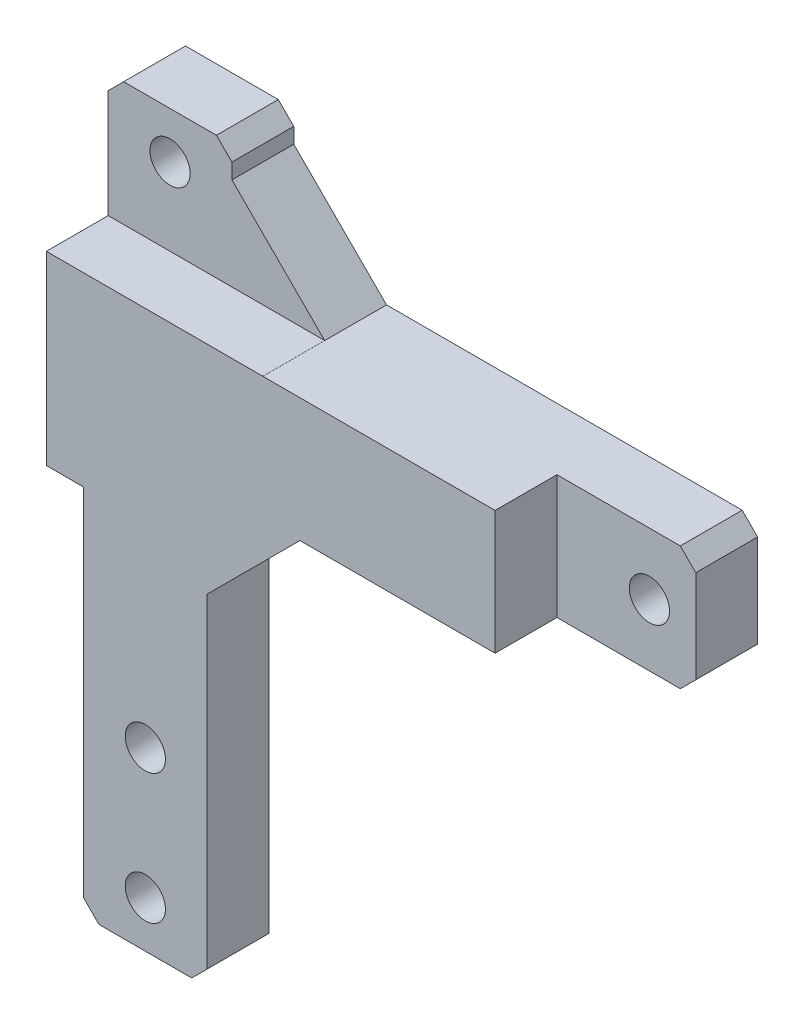
ISO-10303-21;
HEADER;
FILE_DESCRIPTION(('STEP AP214'),'2;1');
FILE_NAME('part.step','',(''),(''),'','','');
FILE_SCHEMA(('AUTOMOTIVE_DESIGN { 1 0 10303 214 1 1 1 1 }'));
ENDSEC;
DATA;
#1=APPLICATION_CONTEXT('core data for automotive mechanical design processes');
#2=APPLICATION_PROTOCOL_DEFINITION('international standard','automotive_design',2000,#1);
#3=PRODUCT_CONTEXT('',#1,'mechanical');
#4=PRODUCT('Part','Part','',(#3));
#5=PRODUCT_RELATED_PRODUCT_CATEGORY('part','',(#4));
#6=PRODUCT_DEFINITION_FORMATION('','',#4);
#7=PRODUCT_DEFINITION_CONTEXT('part definition',#1,'design');
#8=PRODUCT_DEFINITION('design','',#6,#7);
#9=PRODUCT_DEFINITION_SHAPE('','',#8);
#10=(LENGTH_UNIT() NAMED_UNIT(*) SI_UNIT(.MILLI.,.METRE.));
#11=(NAMED_UNIT(*) PLANE_ANGLE_UNIT() SI_UNIT($,.RADIAN.));
#12=(NAMED_UNIT(*) SI_UNIT($,.STERADIAN.) SOLID_ANGLE_UNIT());
#13=UNCERTAINTY_MEASURE_WITH_UNIT(LENGTH_MEASURE(1.E-05),#10,'distance_accuracy_value','');
#14=(GEOMETRIC_REPRESENTATION_CONTEXT(3) GLOBAL_UNCERTAINTY_ASSIGNED_CONTEXT((#13)) GLOBAL_UNIT_ASSIGNED_CONTEXT((#10,
#11,#12)) REPRESENTATION_CONTEXT('',''));
#15=CARTESIAN_POINT('',(0.,0.,0.));
#16=DIRECTION('',(0.,0.,1.));
#17=DIRECTION('',(1.,0.,0.));
#18=AXIS2_PLACEMENT_3D('',#15,#16,#17);
#19=CARTESIAN_POINT('',(0.,0.,4.));
#20=DIRECTION('',(0.,0.,1.));
#21=DIRECTION('',(1.,0.,0.));
#22=AXIS2_PLACEMENT_3D('',#19,#20,#21);
#23=PLANE('',#22);
#24=CARTESIAN_POINT('',(-6.29999999999999,-15.,4.));
#25=DIRECTION('',(0.,0.,1.));
#26=DIRECTION('',(1.,0.,0.));
#27=AXIS2_PLACEMENT_3D('',#24,#25,#26);
#28=CIRCLE('',#27,0.65);
#29=CARTESIAN_POINT('',(-5.65,-15.,4.));
#30=VERTEX_POINT('',#29);
#31=EDGE_CURVE('E274',#30,#30,#28,.T.);
#32=ORIENTED_EDGE('',*,*,#31,.F.);
#33=EDGE_LOOP('',(#32));
#34=FACE_BOUND('',#33,.T.);
#35=CARTESIAN_POINT('',(-6.29999999999999,-10.8,4.));
#36=DIRECTION('',(0.,0.,1.));
#37=DIRECTION('',(1.,0.,0.));
#38=AXIS2_PLACEMENT_3D('',#35,#36,#37);
#39=CIRCLE('',#38,0.65);
#40=CARTESIAN_POINT('',(-5.65,-10.8,4.));
#41=VERTEX_POINT('',#40);
#42=EDGE_CURVE('E271',#41,#41,#39,.T.);
#43=ORIENTED_EDGE('',*,*,#42,.F.);
#44=EDGE_LOOP('',(#43));
#45=FACE_BOUND('',#44,.T.);
#46=DIRECTION('',(1.,0.,0.));
#47=VECTOR('',#46,1.);
#48=CARTESIAN_POINT('',(-8.3,-16.5,4.));
#49=LINE('',#48,#47);
#50=CARTESIAN_POINT('',(-7.79999999999999,-16.5,4.));
#51=VERTEX_POINT('',#50);
#52=CARTESIAN_POINT('',(-4.8,-16.5,4.));
#53=VERTEX_POINT('',#52);
#54=EDGE_CURVE('E295',#51,#53,#49,.T.);
#55=ORIENTED_EDGE('',*,*,#54,.T.);
#56=DIRECTION('',(-0.707106781186551,-0.707106781186544,0.));
#57=VECTOR('',#56,1.);
#58=CARTESIAN_POINT('',(5.85000000000002,-5.85000000000008,4.));
#59=LINE('',#58,#57);
#60=CARTESIAN_POINT('',(-4.29999999999999,-16.,4.));
#61=VERTEX_POINT('',#60);
#62=EDGE_CURVE('E374',#53,#61,#59,.F.);
#63=ORIENTED_EDGE('',*,*,#62,.T.);
#64=DIRECTION('',(0.,1.,0.));
#65=VECTOR('',#64,1.);
#66=CARTESIAN_POINT('',(-4.29999999999999,-16.5,4.));
#67=LINE('',#66,#65);
#68=CARTESIAN_POINT('',(-4.29999999999999,-5.49999999999999,4.));
#69=VERTEX_POINT('',#68);
#70=EDGE_CURVE('E298',#61,#69,#67,.T.);
#71=ORIENTED_EDGE('',*,*,#70,.T.);
#72=DIRECTION('',(-0.707106781186551,-0.707106781186544,0.));
#73=VECTOR('',#72,1.);
#74=CARTESIAN_POINT('',(-1.29999999999997,-2.5,4.));
#75=LINE('',#74,#73);
#76=CARTESIAN_POINT('',(-1.29999999999997,-2.5,4.));
#77=VERTEX_POINT('',#76);
#78=EDGE_CURVE('E346',#69,#77,#75,.F.);
#79=ORIENTED_EDGE('',*,*,#78,.T.);
#80=DIRECTION('',(1.,0.,0.));
#81=VECTOR('',#80,1.);
#82=CARTESIAN_POINT('',(-4.29999999999999,-2.5,4.));
#83=LINE('',#82,#81);
#84=CARTESIAN_POINT('',(5.01005685993889,-2.5,4.));
#85=VERTEX_POINT('',#84);
#86=EDGE_CURVE('E300',#77,#85,#83,.T.);
#87=ORIENTED_EDGE('',*,*,#86,.T.);
#88=DIRECTION('',(0.,1.,0.));
#89=VECTOR('',#88,1.);
#90=CARTESIAN_POINT('',(5.01005685993889,1.5,4.));
#91=LINE('',#90,#89);
#92=CARTESIAN_POINT('',(5.01005685993889,1.5,4.));
#93=VERTEX_POINT('',#92);
#94=EDGE_CURVE('E218',#85,#93,#91,.T.);
#95=ORIENTED_EDGE('',*,*,#94,.T.);
#96=DIRECTION('',(-1.,0.,0.));
#97=VECTOR('',#96,1.);
#98=CARTESIAN_POINT('',(-5.5,1.5,4.));
#99=LINE('',#98,#97);
#100=CARTESIAN_POINT('',(-2.50000000000001,1.5,4.));
#101=VERTEX_POINT('',#100);
#102=EDGE_CURVE('E284',#93,#101,#99,.T.);
#103=ORIENTED_EDGE('',*,*,#102,.T.);
#104=DIRECTION('',(0.707106781186544,-0.707106781186551,0.));
#105=VECTOR('',#104,1.);
#106=CARTESIAN_POINT('',(-5.5,4.50000000000002,4.));
#107=LINE('',#106,#105);
#108=CARTESIAN_POINT('',(-2.50112500265622,1.50112500265622,4.));
#109=VERTEX_POINT('',#108);
#110=EDGE_CURVE('E351',#101,#109,#107,.F.);
#111=ORIENTED_EDGE('',*,*,#110,.T.);
#112=DIRECTION('',(-1.,0.,0.));
#113=VECTOR('',#112,1.);
#114=CARTESIAN_POINT('',(-5.5,1.50112500265622,4.));
#115=LINE('',#114,#113);
#116=CARTESIAN_POINT('',(-9.5,1.50112500265622,4.));
#117=VERTEX_POINT('',#116);
#118=EDGE_CURVE('E235',#109,#117,#115,.T.);
#119=ORIENTED_EDGE('',*,*,#118,.T.);
#120=DIRECTION('',(0.,-1.,0.));
#121=VECTOR('',#120,1.);
#122=CARTESIAN_POINT('',(-9.5,1.5,4.));
#123=LINE('',#122,#121);
#124=CARTESIAN_POINT('',(-9.5,-4.5,4.));
#125=VERTEX_POINT('',#124);
#126=EDGE_CURVE('E287',#117,#125,#123,.T.);
#127=ORIENTED_EDGE('',*,*,#126,.T.);
#128=DIRECTION('',(1.,0.,0.));
#129=VECTOR('',#128,1.);
#130=CARTESIAN_POINT('',(-9.5,-4.5,4.));
#131=LINE('',#130,#129);
#132=CARTESIAN_POINT('',(-8.3,-4.5,4.));
#133=VERTEX_POINT('',#132);
#134=EDGE_CURVE('E290',#125,#133,#131,.T.);
#135=ORIENTED_EDGE('',*,*,#134,.T.);
#136=DIRECTION('',(0.,-1.,0.));
#137=VECTOR('',#136,1.);
#138=CARTESIAN_POINT('',(-8.3,-4.5,4.));
#139=LINE('',#138,#137);
#140=CARTESIAN_POINT('',(-8.3,-16.,4.));
#141=VERTEX_POINT('',#140);
#142=EDGE_CURVE('E292',#133,#141,#139,.T.);
#143=ORIENTED_EDGE('',*,*,#142,.T.);
#144=DIRECTION('',(-0.707106781186545,0.70710678118655,0.));
#145=VECTOR('',#144,1.);
#146=CARTESIAN_POINT('',(-12.15,-12.1499999999999,4.));
#147=LINE('',#146,#145);
#148=EDGE_CURVE('E372',#141,#51,#147,.F.);
#149=ORIENTED_EDGE('',*,*,#148,.T.);
#150=EDGE_LOOP('',(#55,#63,#71,#79,#87,#95,#103,#111,#119,#127,#135,#143,#149));
#151=FACE_BOUND('',#150,.T.);
#152=ADVANCED_FACE('F42',(#34,#45,#151),#23,.T.);
#153=CARTESIAN_POINT('',(0.,0.,0.));
#154=DIRECTION('',(0.,0.,1.));
#155=DIRECTION('',(1.,0.,0.));
#156=AXIS2_PLACEMENT_3D('',#153,#154,#155);
#157=PLANE('',#156);
#158=CARTESIAN_POINT('',(-7.5,4.,0.));
#159=DIRECTION('',(0.,0.,1.));
#160=DIRECTION('',(1.,0.,0.));
#161=AXIS2_PLACEMENT_3D('',#158,#159,#160);
#162=CIRCLE('',#161,0.65);
#163=CARTESIAN_POINT('',(-6.85,4.,0.));
#164=VERTEX_POINT('',#163);
#165=EDGE_CURVE('E277',#164,#164,#162,.T.);
#166=ORIENTED_EDGE('',*,*,#165,.T.);
#167=EDGE_LOOP('',(#166));
#168=FACE_BOUND('',#167,.T.);
#169=CARTESIAN_POINT('',(8.,-0.5,0.));
#170=DIRECTION('',(0.,0.,1.));
#171=DIRECTION('',(1.,0.,0.));
#172=AXIS2_PLACEMENT_3D('',#169,#170,#171);
#173=CIRCLE('',#172,0.649999999999999);
#174=CARTESIAN_POINT('',(8.65,-0.5,0.));
#175=VERTEX_POINT('',#174);
#176=EDGE_CURVE('E280',#175,#175,#173,.T.);
#177=ORIENTED_EDGE('',*,*,#176,.T.);
#178=EDGE_LOOP('',(#177));
#179=FACE_BOUND('',#178,.T.);
#180=DIRECTION('',(0.,-1.,0.));
#181=VECTOR('',#180,1.);
#182=CARTESIAN_POINT('',(-9.5,1.5,0.));
#183=LINE('',#182,#181);
#184=CARTESIAN_POINT('',(-9.5,4.99999999999999,0.));
#185=VERTEX_POINT('',#184);
#186=CARTESIAN_POINT('',(-9.5,-4.5,0.));
#187=VERTEX_POINT('',#186);
#188=EDGE_CURVE('E313',#185,#187,#183,.T.);
#189=ORIENTED_EDGE('',*,*,#188,.F.);
#190=DIRECTION('',(-0.707106781186551,-0.707106781186544,0.));
#191=VECTOR('',#190,1.);
#192=CARTESIAN_POINT('',(-9.5,5.,0.));
#193=LINE('',#192,#191);
#194=CARTESIAN_POINT('',(-8.99999999999999,5.5,0.));
#195=VERTEX_POINT('',#194);
#196=EDGE_CURVE('E387',#185,#195,#193,.F.);
#197=ORIENTED_EDGE('',*,*,#196,.T.);
#198=DIRECTION('',(-1.,0.,0.));
#199=VECTOR('',#198,1.);
#200=CARTESIAN_POINT('',(-9.5,5.5,0.));
#201=LINE('',#200,#199);
#202=CARTESIAN_POINT('',(-6.,5.5,0.));
#203=VERTEX_POINT('',#202);
#204=EDGE_CURVE('E310',#203,#195,#201,.T.);
#205=ORIENTED_EDGE('',*,*,#204,.F.);
#206=DIRECTION('',(-0.707106781186544,0.707106781186551,0.));
#207=VECTOR('',#206,1.);
#208=CARTESIAN_POINT('',(-6.,5.5,0.));
#209=LINE('',#208,#207);
#210=CARTESIAN_POINT('',(-5.5,4.99999999999999,0.));
#211=VERTEX_POINT('',#210);
#212=EDGE_CURVE('E381',#203,#211,#209,.F.);
#213=ORIENTED_EDGE('',*,*,#212,.T.);
#214=DIRECTION('',(0.,1.,0.));
#215=VECTOR('',#214,1.);
#216=CARTESIAN_POINT('',(-5.5,1.5,0.));
#217=LINE('',#216,#215);
#218=CARTESIAN_POINT('',(-5.5,4.50000000000002,0.));
#219=VERTEX_POINT('',#218);
#220=EDGE_CURVE('E307',#219,#211,#217,.T.);
#221=ORIENTED_EDGE('',*,*,#220,.F.);
#222=DIRECTION('',(-0.707106781186544,0.707106781186551,0.));
#223=VECTOR('',#222,1.);
#224=CARTESIAN_POINT('',(-0.500000000000016,-0.500000000000011,0.));
#225=LINE('',#224,#223);
#226=CARTESIAN_POINT('',(-2.50000000000001,1.5,0.));
#227=VERTEX_POINT('',#226);
#228=EDGE_CURVE('E348',#219,#227,#225,.F.);
#229=ORIENTED_EDGE('',*,*,#228,.T.);
#230=DIRECTION('',(-1.,0.,0.));
#231=VECTOR('',#230,1.);
#232=CARTESIAN_POINT('',(-5.5,1.5,0.));
#233=LINE('',#232,#231);
#234=CARTESIAN_POINT('',(9.,1.5,0.));
#235=VERTEX_POINT('',#234);
#236=EDGE_CURVE('E305',#235,#227,#233,.T.);
#237=ORIENTED_EDGE('',*,*,#236,.F.);
#238=DIRECTION('',(-0.707106781186544,0.707106781186551,0.));
#239=VECTOR('',#238,1.);
#240=CARTESIAN_POINT('',(9.,1.5,0.));
#241=LINE('',#240,#239);
#242=CARTESIAN_POINT('',(9.5,0.999999999999991,0.));
#243=VERTEX_POINT('',#242);
#244=EDGE_CURVE('E383',#235,#243,#241,.F.);
#245=ORIENTED_EDGE('',*,*,#244,.T.);
#246=DIRECTION('',(0.,1.,0.));
#247=VECTOR('',#246,1.);
#248=CARTESIAN_POINT('',(9.5,1.5,0.));
#249=LINE('',#248,#247);
#250=CARTESIAN_POINT('',(9.5,-2.,0.));
#251=VERTEX_POINT('',#250);
#252=EDGE_CURVE('E283',#251,#243,#249,.T.);
#253=ORIENTED_EDGE('',*,*,#252,.F.);
#254=DIRECTION('',(0.707106781186552,0.707106781186543,0.));
#255=VECTOR('',#254,1.);
#256=CARTESIAN_POINT('',(9.5,-2.,0.));
#257=LINE('',#256,#255);
#258=CARTESIAN_POINT('',(8.99999999999999,-2.5,0.));
#259=VERTEX_POINT('',#258);
#260=EDGE_CURVE('E385',#251,#259,#257,.F.);
#261=ORIENTED_EDGE('',*,*,#260,.T.);
#262=DIRECTION('',(1.,0.,0.));
#263=VECTOR('',#262,1.);
#264=CARTESIAN_POINT('',(-4.29999999999999,-2.5,0.));
#265=LINE('',#264,#263);
#266=CARTESIAN_POINT('',(-1.29999999999997,-2.5,0.));
#267=VERTEX_POINT('',#266);
#268=EDGE_CURVE('E288',#267,#259,#265,.T.);
#269=ORIENTED_EDGE('',*,*,#268,.F.);
#270=DIRECTION('',(0.707106781186551,0.707106781186544,0.));
#271=VECTOR('',#270,1.);
#272=CARTESIAN_POINT('',(0.600000000000021,-0.600000000000028,0.));
#273=LINE('',#272,#271);
#274=CARTESIAN_POINT('',(-3.6687128154348,-4.8687128154348,0.));
#275=VERTEX_POINT('',#274);
#276=EDGE_CURVE('E337',#267,#275,#273,.F.);
#277=ORIENTED_EDGE('',*,*,#276,.T.);
#278=DIRECTION('',(-1.,0.,0.));
#279=VECTOR('',#278,1.);
#280=CARTESIAN_POINT('',(-8.3,-4.8687128154348,0.));
#281=LINE('',#280,#279);
#282=CARTESIAN_POINT('',(-8.3,-4.8687128154348,0.));
#283=VERTEX_POINT('',#282);
#284=EDGE_CURVE('E256',#275,#283,#281,.T.);
#285=ORIENTED_EDGE('',*,*,#284,.T.);
#286=DIRECTION('',(0.,-1.,0.));
#287=VECTOR('',#286,1.);
#288=CARTESIAN_POINT('',(-8.3,-4.5,0.));
#289=LINE('',#288,#287);
#290=CARTESIAN_POINT('',(-8.3,-4.5,0.));
#291=VERTEX_POINT('',#290);
#292=EDGE_CURVE('E317',#291,#283,#289,.T.);
#293=ORIENTED_EDGE('',*,*,#292,.F.);
#294=DIRECTION('',(1.,0.,0.));
#295=VECTOR('',#294,1.);
#296=CARTESIAN_POINT('',(-9.5,-4.5,0.));
#297=LINE('',#296,#295);
#298=EDGE_CURVE('E315',#187,#291,#297,.T.);
#299=ORIENTED_EDGE('',*,*,#298,.F.);
#300=EDGE_LOOP('',(#189,#197,#205,#213,#221,#229,#237,#245,#253,#261,#269,#277,#285,#293,#299));
#301=FACE_BOUND('',#300,.T.);
#302=ADVANCED_FACE('F414',(#168,#179,#301),#157,.F.);
#303=CARTESIAN_POINT('',(9.5,1.5,4.));
#304=DIRECTION('',(-1.,0.,0.));
#305=DIRECTION('',(0.,0.,1.));
#306=AXIS2_PLACEMENT_3D('',#303,#304,#305);
#307=PLANE('',#306);
#308=DIRECTION('',(0.,-1.,0.));
#309=VECTOR('',#308,1.);
#310=CARTESIAN_POINT('',(9.5,1.5,2.));
#311=LINE('',#310,#309);
#312=CARTESIAN_POINT('',(9.5,0.999999999999991,2.));
#313=VERTEX_POINT('',#312);
#314=CARTESIAN_POINT('',(9.5,-2.,2.));
#315=VERTEX_POINT('',#314);
#316=EDGE_CURVE('E212',#313,#315,#311,.T.);
#317=ORIENTED_EDGE('',*,*,#316,.T.);
#318=DIRECTION('',(0.,0.,-1.));
#319=VECTOR('',#318,1.);
#320=CARTESIAN_POINT('',(9.5,-2.,4.));
#321=LINE('',#320,#319);
#322=EDGE_CURVE('E400',#315,#251,#321,.T.);
#323=ORIENTED_EDGE('',*,*,#322,.T.);
#324=ORIENTED_EDGE('',*,*,#252,.T.);
#325=DIRECTION('',(0.,0.,1.));
#326=VECTOR('',#325,1.);
#327=CARTESIAN_POINT('',(9.5,0.999999999999991,4.));
#328=LINE('',#327,#326);
#329=EDGE_CURVE('E398',#243,#313,#328,.T.);
#330=ORIENTED_EDGE('',*,*,#329,.T.);
#331=EDGE_LOOP('',(#317,#323,#324,#330));
#332=FACE_BOUND('',#331,.T.);
#333=ADVANCED_FACE('F439',(#332),#307,.F.);
#334=CARTESIAN_POINT('',(-5.5,1.5,4.));
#335=DIRECTION('',(0.,-1.,0.));
#336=DIRECTION('',(1.,0.,0.));
#337=AXIS2_PLACEMENT_3D('',#334,#335,#336);
#338=PLANE('',#337);
#339=DIRECTION('',(1.,0.,0.));
#340=VECTOR('',#339,1.);
#341=CARTESIAN_POINT('',(5.01005685993889,1.5,2.));
#342=LINE('',#341,#340);
#343=CARTESIAN_POINT('',(5.01005685993889,1.5,2.));
#344=VERTEX_POINT('',#343);
#345=CARTESIAN_POINT('',(9.,1.5,2.));
#346=VERTEX_POINT('',#345);
#347=EDGE_CURVE('E224',#344,#346,#342,.T.);
#348=ORIENTED_EDGE('',*,*,#347,.T.);
#349=DIRECTION('',(0.,0.,-1.));
#350=VECTOR('',#349,1.);
#351=CARTESIAN_POINT('',(9.,1.5,4.));
#352=LINE('',#351,#350);
#353=EDGE_CURVE('E51',#346,#235,#352,.T.);
#354=ORIENTED_EDGE('',*,*,#353,.T.);
#355=ORIENTED_EDGE('',*,*,#236,.T.);
#356=DIRECTION('',(0.,0.,1.));
#357=VECTOR('',#356,1.);
#358=CARTESIAN_POINT('',(-2.50000000000001,1.5,4.));
#359=LINE('',#358,#357);
#360=EDGE_CURVE('E335',#227,#101,#359,.T.);
#361=ORIENTED_EDGE('',*,*,#360,.T.);
#362=ORIENTED_EDGE('',*,*,#102,.F.);
#363=DIRECTION('',(0.,0.,1.));
#364=VECTOR('',#363,1.);
#365=CARTESIAN_POINT('',(5.01005685993889,1.5,2.));
#366=LINE('',#365,#364);
#367=EDGE_CURVE('E220',#344,#93,#366,.T.);
#368=ORIENTED_EDGE('',*,*,#367,.F.);
#369=EDGE_LOOP('',(#348,#354,#355,#361,#362,#368));
#370=FACE_BOUND('',#369,.T.);
#371=ADVANCED_FACE('F410',(#370),#338,.F.);
#372=CARTESIAN_POINT('',(-5.5,1.5,4.));
#373=DIRECTION('',(-1.,0.,0.));
#374=DIRECTION('',(0.,0.,1.));
#375=AXIS2_PLACEMENT_3D('',#372,#373,#374);
#376=PLANE('',#375);
#377=ORIENTED_EDGE('',*,*,#220,.T.);
#378=DIRECTION('',(0.,0.,1.));
#379=VECTOR('',#378,1.);
#380=CARTESIAN_POINT('',(-5.5,4.99999999999999,4.));
#381=LINE('',#380,#379);
#382=CARTESIAN_POINT('',(-5.5,4.99999999999999,2.));
#383=VERTEX_POINT('',#382);
#384=EDGE_CURVE('E12',#211,#383,#381,.T.);
#385=ORIENTED_EDGE('',*,*,#384,.T.);
#386=DIRECTION('',(0.,-1.,0.));
#387=VECTOR('',#386,1.);
#388=CARTESIAN_POINT('',(-5.5,5.5,2.));
#389=LINE('',#388,#387);
#390=CARTESIAN_POINT('',(-5.5,4.50000000000002,2.));
#391=VERTEX_POINT('',#390);
#392=EDGE_CURVE('E245',#383,#391,#389,.T.);
#393=ORIENTED_EDGE('',*,*,#392,.T.);
#394=DIRECTION('',(0.,0.,-1.));
#395=VECTOR('',#394,1.);
#396=CARTESIAN_POINT('',(-5.5,4.50000000000002,0.));
#397=LINE('',#396,#395);
#398=EDGE_CURVE('E332',#391,#219,#397,.T.);
#399=ORIENTED_EDGE('',*,*,#398,.T.);
#400=EDGE_LOOP('',(#377,#385,#393,#399));
#401=FACE_BOUND('',#400,.T.);
#402=ADVANCED_FACE('F489',(#401),#376,.F.);
#403=CARTESIAN_POINT('',(-9.5,5.5,4.));
#404=DIRECTION('',(0.,-1.,0.));
#405=DIRECTION('',(0.,0.,-1.));
#406=AXIS2_PLACEMENT_3D('',#403,#404,#405);
#407=PLANE('',#406);
#408=ORIENTED_EDGE('',*,*,#204,.T.);
#409=DIRECTION('',(0.,0.,1.));
#410=VECTOR('',#409,1.);
#411=CARTESIAN_POINT('',(-8.99999999999999,5.5,4.));
#412=LINE('',#411,#410);
#413=CARTESIAN_POINT('',(-8.99999999999999,5.5,2.));
#414=VERTEX_POINT('',#413);
#415=EDGE_CURVE('E392',#195,#414,#412,.T.);
#416=ORIENTED_EDGE('',*,*,#415,.T.);
#417=DIRECTION('',(1.,0.,0.));
#418=VECTOR('',#417,1.);
#419=CARTESIAN_POINT('',(-9.5,5.5,2.));
#420=LINE('',#419,#418);
#421=CARTESIAN_POINT('',(-6.,5.5,2.));
#422=VERTEX_POINT('',#421);
#423=EDGE_CURVE('E239',#414,#422,#420,.T.);
#424=ORIENTED_EDGE('',*,*,#423,.T.);
#425=DIRECTION('',(0.,0.,-1.));
#426=VECTOR('',#425,1.);
#427=CARTESIAN_POINT('',(-6.,5.5,4.));
#428=LINE('',#427,#426);
#429=EDGE_CURVE('E389',#422,#203,#428,.T.);
#430=ORIENTED_EDGE('',*,*,#429,.T.);
#431=EDGE_LOOP('',(#408,#416,#424,#430));
#432=FACE_BOUND('',#431,.T.);
#433=ADVANCED_FACE('F485',(#432),#407,.F.);
#434=CARTESIAN_POINT('',(-9.5,1.5,4.));
#435=DIRECTION('',(1.,0.,0.));
#436=DIRECTION('',(0.,1.,0.));
#437=AXIS2_PLACEMENT_3D('',#434,#435,#436);
#438=PLANE('',#437);
#439=DIRECTION('',(0.,1.,0.));
#440=VECTOR('',#439,1.);
#441=CARTESIAN_POINT('',(-9.5,1.50112500265622,2.));
#442=LINE('',#441,#440);
#443=CARTESIAN_POINT('',(-9.5,1.50112500265622,2.));
#444=VERTEX_POINT('',#443);
#445=CARTESIAN_POINT('',(-9.5,4.99999999999999,2.));
#446=VERTEX_POINT('',#445);
#447=EDGE_CURVE('E234',#444,#446,#442,.T.);
#448=ORIENTED_EDGE('',*,*,#447,.T.);
#449=DIRECTION('',(0.,0.,-1.));
#450=VECTOR('',#449,1.);
#451=CARTESIAN_POINT('',(-9.5,4.99999999999999,4.));
#452=LINE('',#451,#450);
#453=EDGE_CURVE('E378',#446,#185,#452,.T.);
#454=ORIENTED_EDGE('',*,*,#453,.T.);
#455=ORIENTED_EDGE('',*,*,#188,.T.);
#456=DIRECTION('',(0.,0.,-1.));
#457=VECTOR('',#456,1.);
#458=CARTESIAN_POINT('',(-9.5,-4.5,4.));
#459=LINE('',#458,#457);
#460=EDGE_CURVE('E323',#125,#187,#459,.T.);
#461=ORIENTED_EDGE('',*,*,#460,.F.);
#462=ORIENTED_EDGE('',*,*,#126,.F.);
#463=DIRECTION('',(0.,0.,1.));
#464=VECTOR('',#463,1.);
#465=CARTESIAN_POINT('',(-9.5,1.50112500265622,2.));
#466=LINE('',#465,#464);
#467=EDGE_CURVE('E232',#444,#117,#466,.T.);
#468=ORIENTED_EDGE('',*,*,#467,.F.);
#469=EDGE_LOOP('',(#448,#454,#455,#461,#462,#468));
#470=FACE_BOUND('',#469,.T.);
#471=ADVANCED_FACE('F481',(#470),#438,.F.);
#472=CARTESIAN_POINT('',(-9.5,-4.5,4.));
#473=DIRECTION('',(0.,1.,0.));
#474=DIRECTION('',(0.,0.,1.));
#475=AXIS2_PLACEMENT_3D('',#472,#473,#474);
#476=PLANE('',#475);
#477=ORIENTED_EDGE('',*,*,#298,.T.);
#478=DIRECTION('',(0.,0.,-1.));
#479=VECTOR('',#478,1.);
#480=CARTESIAN_POINT('',(-8.3,-4.5,4.));
#481=LINE('',#480,#479);
#482=EDGE_CURVE('E302',#133,#291,#481,.T.);
#483=ORIENTED_EDGE('',*,*,#482,.F.);
#484=ORIENTED_EDGE('',*,*,#134,.F.);
#485=ORIENTED_EDGE('',*,*,#460,.T.);
#486=EDGE_LOOP('',(#477,#483,#484,#485));
#487=FACE_BOUND('',#486,.T.);
#488=ADVANCED_FACE('F477',(#487),#476,.F.);
#489=CARTESIAN_POINT('',(-8.3,-4.5,4.));
#490=DIRECTION('',(1.,0.,0.));
#491=DIRECTION('',(0.,1.,0.));
#492=AXIS2_PLACEMENT_3D('',#489,#490,#491);
#493=PLANE('',#492);
#494=DIRECTION('',(0.,-1.,0.));
#495=VECTOR('',#494,1.);
#496=CARTESIAN_POINT('',(-8.3,-4.8687128154348,2.));
#497=LINE('',#496,#495);
#498=CARTESIAN_POINT('',(-8.3,-4.8687128154348,2.));
#499=VERTEX_POINT('',#498);
#500=CARTESIAN_POINT('',(-8.3,-16.,2.));
#501=VERTEX_POINT('',#500);
#502=EDGE_CURVE('E264',#499,#501,#497,.T.);
#503=ORIENTED_EDGE('',*,*,#502,.T.);
#504=DIRECTION('',(0.,0.,1.));
#505=VECTOR('',#504,1.);
#506=CARTESIAN_POINT('',(-8.3,-16.,4.));
#507=LINE('',#506,#505);
#508=EDGE_CURVE('E376',#501,#141,#507,.T.);
#509=ORIENTED_EDGE('',*,*,#508,.T.);
#510=ORIENTED_EDGE('',*,*,#142,.F.);
#511=ORIENTED_EDGE('',*,*,#482,.T.);
#512=ORIENTED_EDGE('',*,*,#292,.T.);
#513=DIRECTION('',(0.,0.,-1.));
#514=VECTOR('',#513,1.);
#515=CARTESIAN_POINT('',(-8.3,-4.8687128154348,2.));
#516=LINE('',#515,#514);
#517=EDGE_CURVE('E267',#499,#283,#516,.T.);
#518=ORIENTED_EDGE('',*,*,#517,.F.);
#519=EDGE_LOOP('',(#503,#509,#510,#511,#512,#518));
#520=FACE_BOUND('',#519,.T.);
#521=ADVANCED_FACE('F473',(#520),#493,.F.);
#522=CARTESIAN_POINT('',(-8.3,-16.5,4.));
#523=DIRECTION('',(0.,1.,0.));
#524=DIRECTION('',(0.,0.,1.));
#525=AXIS2_PLACEMENT_3D('',#522,#523,#524);
#526=PLANE('',#525);
#527=DIRECTION('',(1.,0.,0.));
#528=VECTOR('',#527,1.);
#529=CARTESIAN_POINT('',(-8.3,-16.5,2.));
#530=LINE('',#529,#528);
#531=CARTESIAN_POINT('',(-7.79999999999999,-16.5,2.));
#532=VERTEX_POINT('',#531);
#533=CARTESIAN_POINT('',(-4.8,-16.5,2.));
#534=VERTEX_POINT('',#533);
#535=EDGE_CURVE('E257',#532,#534,#530,.T.);
#536=ORIENTED_EDGE('',*,*,#535,.T.);
#537=DIRECTION('',(0.,0.,1.));
#538=VECTOR('',#537,1.);
#539=CARTESIAN_POINT('',(-4.8,-16.5,4.));
#540=LINE('',#539,#538);
#541=EDGE_CURVE('E370',#534,#53,#540,.T.);
#542=ORIENTED_EDGE('',*,*,#541,.T.);
#543=ORIENTED_EDGE('',*,*,#54,.F.);
#544=DIRECTION('',(0.,0.,-1.));
#545=VECTOR('',#544,1.);
#546=CARTESIAN_POINT('',(-7.79999999999999,-16.5,4.));
#547=LINE('',#546,#545);
#548=EDGE_CURVE('E367',#51,#532,#547,.T.);
#549=ORIENTED_EDGE('',*,*,#548,.T.);
#550=EDGE_LOOP('',(#536,#542,#543,#549));
#551=FACE_BOUND('',#550,.T.);
#552=ADVANCED_FACE('F469',(#551),#526,.F.);
#553=CARTESIAN_POINT('',(-4.29999999999999,-16.5,4.));
#554=DIRECTION('',(-1.,0.,0.));
#555=DIRECTION('',(0.,0.,1.));
#556=AXIS2_PLACEMENT_3D('',#553,#554,#555);
#557=PLANE('',#556);
#558=ORIENTED_EDGE('',*,*,#70,.F.);
#559=DIRECTION('',(0.,0.,-1.));
#560=VECTOR('',#559,1.);
#561=CARTESIAN_POINT('',(-4.29999999999999,-16.,4.));
#562=LINE('',#561,#560);
#563=CARTESIAN_POINT('',(-4.29999999999999,-16.,2.));
#564=VERTEX_POINT('',#563);
#565=EDGE_CURVE('E360',#61,#564,#562,.T.);
#566=ORIENTED_EDGE('',*,*,#565,.T.);
#567=DIRECTION('',(0.,1.,0.));
#568=VECTOR('',#567,1.);
#569=CARTESIAN_POINT('',(-4.29999999999999,-16.5,2.));
#570=LINE('',#569,#568);
#571=CARTESIAN_POINT('',(-4.29999999999999,-5.49999999999999,2.));
#572=VERTEX_POINT('',#571);
#573=EDGE_CURVE('E260',#564,#572,#570,.T.);
#574=ORIENTED_EDGE('',*,*,#573,.T.);
#575=DIRECTION('',(0.,0.,1.));
#576=VECTOR('',#575,1.);
#577=CARTESIAN_POINT('',(-4.29999999999999,-5.49999999999999,4.));
#578=LINE('',#577,#576);
#579=EDGE_CURVE('E329',#572,#69,#578,.T.);
#580=ORIENTED_EDGE('',*,*,#579,.T.);
#581=EDGE_LOOP('',(#558,#566,#574,#580));
#582=FACE_BOUND('',#581,.T.);
#583=ADVANCED_FACE('F466',(#582),#557,.F.);
#584=CARTESIAN_POINT('',(-4.29999999999999,-2.5,4.));
#585=DIRECTION('',(0.,1.,0.));
#586=DIRECTION('',(0.,0.,1.));
#587=AXIS2_PLACEMENT_3D('',#584,#585,#586);
#588=PLANE('',#587);
#589=ORIENTED_EDGE('',*,*,#268,.T.);
#590=DIRECTION('',(0.,0.,1.));
#591=VECTOR('',#590,1.);
#592=CARTESIAN_POINT('',(8.99999999999999,-2.5,4.));
#593=LINE('',#592,#591);
#594=CARTESIAN_POINT('',(8.99999999999999,-2.5,2.));
#595=VERTEX_POINT('',#594);
#596=EDGE_CURVE('E66',#259,#595,#593,.T.);
#597=ORIENTED_EDGE('',*,*,#596,.T.);
#598=DIRECTION('',(-1.,0.,0.));
#599=VECTOR('',#598,1.);
#600=CARTESIAN_POINT('',(9.5,-2.5,2.));
#601=LINE('',#600,#599);
#602=CARTESIAN_POINT('',(5.01005685993889,-2.5,2.));
#603=VERTEX_POINT('',#602);
#604=EDGE_CURVE('E204',#595,#603,#601,.T.);
#605=ORIENTED_EDGE('',*,*,#604,.T.);
#606=DIRECTION('',(0.,0.,1.));
#607=VECTOR('',#606,1.);
#608=CARTESIAN_POINT('',(5.01005685993889,-2.5,2.));
#609=LINE('',#608,#607);
#610=EDGE_CURVE('E208',#603,#85,#609,.T.);
#611=ORIENTED_EDGE('',*,*,#610,.T.);
#612=ORIENTED_EDGE('',*,*,#86,.F.);
#613=DIRECTION('',(0.,0.,-1.));
#614=VECTOR('',#613,1.);
#615=CARTESIAN_POINT('',(-1.29999999999997,-2.5,0.));
#616=LINE('',#615,#614);
#617=EDGE_CURVE('E326',#77,#267,#616,.T.);
#618=ORIENTED_EDGE('',*,*,#617,.T.);
#619=EDGE_LOOP('',(#589,#597,#605,#611,#612,#618));
#620=FACE_BOUND('',#619,.T.);
#621=ADVANCED_FACE('F206',(#620),#588,.F.);
#622=CARTESIAN_POINT('',(8.,-0.5,4.));
#623=DIRECTION('',(0.,0.,-1.));
#624=DIRECTION('',(-1.,0.,0.));
#625=AXIS2_PLACEMENT_3D('',#622,#623,#624);
#626=CYLINDRICAL_SURFACE('',#625,0.649999999999999);
#627=CARTESIAN_POINT('',(8.,-0.5,2.));
#628=DIRECTION('',(0.,0.,-1.));
#629=DIRECTION('',(-1.,0.,0.));
#630=AXIS2_PLACEMENT_3D('',#627,#628,#629);
#631=CIRCLE('',#630,0.65);
#632=CARTESIAN_POINT('',(7.35,-0.5,2.));
#633=VERTEX_POINT('',#632);
#634=EDGE_CURVE('E230',#633,#633,#631,.T.);
#635=ORIENTED_EDGE('',*,*,#634,.F.);
#636=EDGE_LOOP('',(#635));
#637=FACE_BOUND('',#636,.T.);
#638=ORIENTED_EDGE('',*,*,#176,.F.);
#639=EDGE_LOOP('',(#638));
#640=FACE_BOUND('',#639,.T.);
#641=ADVANCED_FACE('F446',(#637,#640),#626,.F.);
#642=CARTESIAN_POINT('',(-7.5,4.,4.));
#643=DIRECTION('',(0.,0.,-1.));
#644=DIRECTION('',(-1.,0.,0.));
#645=AXIS2_PLACEMENT_3D('',#642,#643,#644);
#646=CYLINDRICAL_SURFACE('',#645,0.65);
#647=CARTESIAN_POINT('',(-7.5,4.,2.));
#648=DIRECTION('',(0.,0.,-1.));
#649=DIRECTION('',(-1.,0.,0.));
#650=AXIS2_PLACEMENT_3D('',#647,#648,#649);
#651=CIRCLE('',#650,0.649999999999999);
#652=CARTESIAN_POINT('',(-8.15,4.,2.));
#653=VERTEX_POINT('',#652);
#654=EDGE_CURVE('E238',#653,#653,#651,.T.);
#655=ORIENTED_EDGE('',*,*,#654,.F.);
#656=EDGE_LOOP('',(#655));
#657=FACE_BOUND('',#656,.T.);
#658=ORIENTED_EDGE('',*,*,#165,.F.);
#659=EDGE_LOOP('',(#658));
#660=FACE_BOUND('',#659,.T.);
#661=ADVANCED_FACE('F449',(#657,#660),#646,.F.);
#662=CARTESIAN_POINT('',(-6.29999999999999,-15.,4.));
#663=DIRECTION('',(0.,0.,-1.));
#664=DIRECTION('',(-1.,0.,0.));
#665=AXIS2_PLACEMENT_3D('',#662,#663,#664);
#666=CYLINDRICAL_SURFACE('',#665,0.65);
#667=CARTESIAN_POINT('',(-6.29999999999999,-15.,2.));
#668=DIRECTION('',(0.,0.,1.));
#669=DIRECTION('',(1.,0.,0.));
#670=AXIS2_PLACEMENT_3D('',#667,#668,#669);
#671=CIRCLE('',#670,0.65);
#672=CARTESIAN_POINT('',(-5.65,-15.,2.));
#673=VERTEX_POINT('',#672);
#674=EDGE_CURVE('E253',#673,#673,#671,.T.);
#675=ORIENTED_EDGE('',*,*,#674,.F.);
#676=EDGE_LOOP('',(#675));
#677=FACE_BOUND('',#676,.T.);
#678=ORIENTED_EDGE('',*,*,#31,.T.);
#679=EDGE_LOOP('',(#678));
#680=FACE_BOUND('',#679,.T.);
#681=ADVANCED_FACE('F594',(#677,#680),#666,.F.);
#682=CARTESIAN_POINT('',(-6.29999999999999,-10.8,4.));
#683=DIRECTION('',(0.,0.,-1.));
#684=DIRECTION('',(-1.,0.,0.));
#685=AXIS2_PLACEMENT_3D('',#682,#683,#684);
#686=CYLINDRICAL_SURFACE('',#685,0.65);
#687=CARTESIAN_POINT('',(-6.29999999999999,-10.8,2.));
#688=DIRECTION('',(0.,0.,1.));
#689=DIRECTION('',(1.,0.,0.));
#690=AXIS2_PLACEMENT_3D('',#687,#688,#689);
#691=CIRCLE('',#690,0.65);
#692=CARTESIAN_POINT('',(-5.65,-10.8,2.));
#693=VERTEX_POINT('',#692);
#694=EDGE_CURVE('E219',#693,#693,#691,.T.);
#695=ORIENTED_EDGE('',*,*,#694,.F.);
#696=EDGE_LOOP('',(#695));
#697=FACE_BOUND('',#696,.T.);
#698=ORIENTED_EDGE('',*,*,#42,.T.);
#699=EDGE_LOOP('',(#698));
#700=FACE_BOUND('',#699,.T.);
#701=ADVANCED_FACE('F588',(#697,#700),#686,.F.);
#702=CARTESIAN_POINT('',(0.,0.,2.));
#703=DIRECTION('',(0.,0.,1.));
#704=DIRECTION('',(1.,0.,0.));
#705=AXIS2_PLACEMENT_3D('',#702,#703,#704);
#706=PLANE('',#705);
#707=ORIENTED_EDGE('',*,*,#674,.T.);
#708=EDGE_LOOP('',(#707));
#709=FACE_BOUND('',#708,.T.);
#710=ORIENTED_EDGE('',*,*,#573,.F.);
#711=DIRECTION('',(0.707106781186551,0.707106781186544,0.));
#712=VECTOR('',#711,1.);
#713=CARTESIAN_POINT('',(-4.29999999999999,-16.,2.));
#714=LINE('',#713,#712);
#715=EDGE_CURVE('E365',#564,#534,#714,.F.);
#716=ORIENTED_EDGE('',*,*,#715,.T.);
#717=ORIENTED_EDGE('',*,*,#535,.F.);
#718=DIRECTION('',(0.707106781186545,-0.70710678118655,0.));
#719=VECTOR('',#718,1.);
#720=CARTESIAN_POINT('',(-7.79999999999999,-16.5,2.));
#721=LINE('',#720,#719);
#722=EDGE_CURVE('E363',#532,#501,#721,.F.);
#723=ORIENTED_EDGE('',*,*,#722,.T.);
#724=ORIENTED_EDGE('',*,*,#502,.F.);
#725=DIRECTION('',(-1.,0.,0.));
#726=VECTOR('',#725,1.);
#727=CARTESIAN_POINT('',(-8.3,-4.8687128154348,2.));
#728=LINE('',#727,#726);
#729=CARTESIAN_POINT('',(-3.6687128154348,-4.8687128154348,2.));
#730=VERTEX_POINT('',#729);
#731=EDGE_CURVE('E262',#730,#499,#728,.T.);
#732=ORIENTED_EDGE('',*,*,#731,.F.);
#733=DIRECTION('',(0.707106781186551,0.707106781186544,0.));
#734=VECTOR('',#733,1.);
#735=CARTESIAN_POINT('',(0.600000000000021,-0.600000000000028,2.));
#736=LINE('',#735,#734);
#737=EDGE_CURVE('E343',#730,#572,#736,.F.);
#738=ORIENTED_EDGE('',*,*,#737,.T.);
#739=EDGE_LOOP('',(#710,#716,#717,#723,#724,#732,#738));
#740=FACE_BOUND('',#739,.T.);
#741=ORIENTED_EDGE('',*,*,#694,.T.);
#742=EDGE_LOOP('',(#741));
#743=FACE_BOUND('',#742,.T.);
#744=ADVANCED_FACE('F571',(#709,#740,#743),#706,.F.);
#745=CARTESIAN_POINT('',(-8.3,-4.8687128154348,2.));
#746=DIRECTION('',(0.,-1.,0.));
#747=DIRECTION('',(0.,0.,-1.));
#748=AXIS2_PLACEMENT_3D('',#745,#746,#747);
#749=PLANE('',#748);
#750=ORIENTED_EDGE('',*,*,#284,.F.);
#751=DIRECTION('',(0.,0.,-1.));
#752=VECTOR('',#751,1.);
#753=CARTESIAN_POINT('',(-3.6687128154348,-4.8687128154348,4.));
#754=LINE('',#753,#752);
#755=EDGE_CURVE('E340',#275,#730,#754,.F.);
#756=ORIENTED_EDGE('',*,*,#755,.T.);
#757=ORIENTED_EDGE('',*,*,#731,.T.);
#758=ORIENTED_EDGE('',*,*,#517,.T.);
#759=EDGE_LOOP('',(#750,#756,#757,#758));
#760=FACE_BOUND('',#759,.T.);
#761=ADVANCED_FACE('F579',(#760),#749,.T.);
#762=CARTESIAN_POINT('',(0.,0.,2.));
#763=DIRECTION('',(0.,0.,-1.));
#764=DIRECTION('',(-1.,0.,0.));
#765=AXIS2_PLACEMENT_3D('',#762,#763,#764);
#766=PLANE('',#765);
#767=ORIENTED_EDGE('',*,*,#423,.F.);
#768=DIRECTION('',(0.707106781186551,0.707106781186544,0.));
#769=VECTOR('',#768,1.);
#770=CARTESIAN_POINT('',(-9.5,5.,2.));
#771=LINE('',#770,#769);
#772=EDGE_CURVE('E396',#414,#446,#771,.F.);
#773=ORIENTED_EDGE('',*,*,#772,.T.);
#774=ORIENTED_EDGE('',*,*,#447,.F.);
#775=DIRECTION('',(-1.,0.,0.));
#776=VECTOR('',#775,1.);
#777=CARTESIAN_POINT('',(-5.5,1.50112500265622,2.));
#778=LINE('',#777,#776);
#779=CARTESIAN_POINT('',(-2.50112500265622,1.50112500265622,2.));
#780=VERTEX_POINT('',#779);
#781=EDGE_CURVE('E242',#780,#444,#778,.T.);
#782=ORIENTED_EDGE('',*,*,#781,.F.);
#783=DIRECTION('',(0.707106781186544,-0.707106781186551,0.));
#784=VECTOR('',#783,1.);
#785=CARTESIAN_POINT('',(-0.500000000000016,-0.500000000000011,2.));
#786=LINE('',#785,#784);
#787=EDGE_CURVE('E357',#780,#391,#786,.F.);
#788=ORIENTED_EDGE('',*,*,#787,.T.);
#789=ORIENTED_EDGE('',*,*,#392,.F.);
#790=DIRECTION('',(0.707106781186544,-0.707106781186551,0.));
#791=VECTOR('',#790,1.);
#792=CARTESIAN_POINT('',(-6.,5.5,2.));
#793=LINE('',#792,#791);
#794=EDGE_CURVE('E394',#383,#422,#793,.F.);
#795=ORIENTED_EDGE('',*,*,#794,.T.);
#796=EDGE_LOOP('',(#767,#773,#774,#782,#788,#789,#795));
#797=FACE_BOUND('',#796,.T.);
#798=ORIENTED_EDGE('',*,*,#654,.T.);
#799=EDGE_LOOP('',(#798));
#800=FACE_BOUND('',#799,.T.);
#801=ADVANCED_FACE('F548',(#797,#800),#766,.F.);
#802=CARTESIAN_POINT('',(-5.5,1.50112500265622,2.));
#803=DIRECTION('',(0.,1.,0.));
#804=DIRECTION('',(0.,0.,1.));
#805=AXIS2_PLACEMENT_3D('',#802,#803,#804);
#806=PLANE('',#805);
#807=ORIENTED_EDGE('',*,*,#118,.F.);
#808=DIRECTION('',(0.,0.,1.));
#809=VECTOR('',#808,1.);
#810=CARTESIAN_POINT('',(-2.50112500265622,1.50112500265621,4.));
#811=LINE('',#810,#809);
#812=EDGE_CURVE('E354',#109,#780,#811,.F.);
#813=ORIENTED_EDGE('',*,*,#812,.T.);
#814=ORIENTED_EDGE('',*,*,#781,.T.);
#815=ORIENTED_EDGE('',*,*,#467,.T.);
#816=EDGE_LOOP('',(#807,#813,#814,#815));
#817=FACE_BOUND('',#816,.T.);
#818=ADVANCED_FACE('F558',(#817),#806,.T.);
#819=CARTESIAN_POINT('',(0.,0.,2.));
#820=DIRECTION('',(0.,0.,-1.));
#821=DIRECTION('',(-1.,0.,0.));
#822=AXIS2_PLACEMENT_3D('',#819,#820,#821);
#823=PLANE('',#822);
#824=ORIENTED_EDGE('',*,*,#604,.F.);
#825=DIRECTION('',(-0.707106781186552,-0.707106781186543,0.));
#826=VECTOR('',#825,1.);
#827=CARTESIAN_POINT('',(9.5,-2.,2.));
#828=LINE('',#827,#826);
#829=EDGE_CURVE('E405',#595,#315,#828,.F.);
#830=ORIENTED_EDGE('',*,*,#829,.T.);
#831=ORIENTED_EDGE('',*,*,#316,.F.);
#832=DIRECTION('',(0.707106781186544,-0.707106781186551,0.));
#833=VECTOR('',#832,1.);
#834=CARTESIAN_POINT('',(9.,1.5,2.));
#835=LINE('',#834,#833);
#836=EDGE_CURVE('E58',#313,#346,#835,.F.);
#837=ORIENTED_EDGE('',*,*,#836,.T.);
#838=ORIENTED_EDGE('',*,*,#347,.F.);
#839=DIRECTION('',(0.,1.,0.));
#840=VECTOR('',#839,1.);
#841=CARTESIAN_POINT('',(5.01005685993889,1.5,2.));
#842=LINE('',#841,#840);
#843=EDGE_CURVE('E211',#603,#344,#842,.T.);
#844=ORIENTED_EDGE('',*,*,#843,.F.);
#845=EDGE_LOOP('',(#824,#830,#831,#837,#838,#844));
#846=FACE_BOUND('',#845,.T.);
#847=ORIENTED_EDGE('',*,*,#634,.T.);
#848=EDGE_LOOP('',(#847));
#849=FACE_BOUND('',#848,.T.);
#850=ADVANCED_FACE('F222',(#846,#849),#823,.F.);
#851=CARTESIAN_POINT('',(5.01005685993889,1.5,2.));
#852=DIRECTION('',(1.,0.,0.));
#853=DIRECTION('',(0.,0.,-1.));
#854=AXIS2_PLACEMENT_3D('',#851,#852,#853);
#855=PLANE('',#854);
#856=ORIENTED_EDGE('',*,*,#94,.F.);
#857=ORIENTED_EDGE('',*,*,#610,.F.);
#858=ORIENTED_EDGE('',*,*,#843,.T.);
#859=ORIENTED_EDGE('',*,*,#367,.T.);
#860=EDGE_LOOP('',(#856,#857,#858,#859));
#861=FACE_BOUND('',#860,.T.);
#862=ADVANCED_FACE('F216',(#861),#855,.T.);
#863=CARTESIAN_POINT('',(-1.29999999999997,-2.5,4.));
#864=DIRECTION('',(0.707106781186544,-0.707106781186551,0.));
#865=DIRECTION('',(0.,0.,1.));
#866=AXIS2_PLACEMENT_3D('',#863,#864,#865);
#867=PLANE('',#866);
#868=ORIENTED_EDGE('',*,*,#78,.F.);
#869=ORIENTED_EDGE('',*,*,#579,.F.);
#870=ORIENTED_EDGE('',*,*,#737,.F.);
#871=ORIENTED_EDGE('',*,*,#755,.F.);
#872=ORIENTED_EDGE('',*,*,#276,.F.);
#873=ORIENTED_EDGE('',*,*,#617,.F.);
#874=EDGE_LOOP('',(#868,#869,#870,#871,#872,#873));
#875=FACE_BOUND('',#874,.T.);
#876=ADVANCED_FACE('F429',(#875),#867,.T.);
#877=CARTESIAN_POINT('',(-5.5,4.50000000000002,4.));
#878=DIRECTION('',(0.707106781186551,0.707106781186544,0.));
#879=DIRECTION('',(0.,0.,1.));
#880=AXIS2_PLACEMENT_3D('',#877,#878,#879);
#881=PLANE('',#880);
#882=ORIENTED_EDGE('',*,*,#110,.F.);
#883=ORIENTED_EDGE('',*,*,#360,.F.);
#884=ORIENTED_EDGE('',*,*,#228,.F.);
#885=ORIENTED_EDGE('',*,*,#398,.F.);
#886=ORIENTED_EDGE('',*,*,#787,.F.);
#887=ORIENTED_EDGE('',*,*,#812,.F.);
#888=EDGE_LOOP('',(#882,#883,#884,#885,#886,#887));
#889=FACE_BOUND('',#888,.T.);
#890=ADVANCED_FACE('F421',(#889),#881,.T.);
#891=CARTESIAN_POINT('',(-4.29999999999999,-16.,4.));
#892=DIRECTION('',(-0.707106781186544,0.707106781186551,0.));
#893=DIRECTION('',(0.,0.,-1.));
#894=AXIS2_PLACEMENT_3D('',#891,#892,#893);
#895=PLANE('',#894);
#896=ORIENTED_EDGE('',*,*,#62,.F.);
#897=ORIENTED_EDGE('',*,*,#541,.F.);
#898=ORIENTED_EDGE('',*,*,#715,.F.);
#899=ORIENTED_EDGE('',*,*,#565,.F.);
#900=EDGE_LOOP('',(#896,#897,#898,#899));
#901=FACE_BOUND('',#900,.T.);
#902=ADVANCED_FACE('F507',(#901),#895,.F.);
#903=CARTESIAN_POINT('',(-7.79999999999999,-16.5,4.));
#904=DIRECTION('',(0.70710678118655,0.707106781186545,0.));
#905=DIRECTION('',(0.,0.,-1.));
#906=AXIS2_PLACEMENT_3D('',#903,#904,#905);
#907=PLANE('',#906);
#908=ORIENTED_EDGE('',*,*,#148,.F.);
#909=ORIENTED_EDGE('',*,*,#508,.F.);
#910=ORIENTED_EDGE('',*,*,#722,.F.);
#911=ORIENTED_EDGE('',*,*,#548,.F.);
#912=EDGE_LOOP('',(#908,#909,#910,#911));
#913=FACE_BOUND('',#912,.T.);
#914=ADVANCED_FACE('F513',(#913),#907,.F.);
#915=CARTESIAN_POINT('',(-9.5,5.,4.));
#916=DIRECTION('',(0.707106781186544,-0.707106781186551,0.));
#917=DIRECTION('',(0.,0.,-1.));
#918=AXIS2_PLACEMENT_3D('',#915,#916,#917);
#919=PLANE('',#918);
#920=ORIENTED_EDGE('',*,*,#772,.F.);
#921=ORIENTED_EDGE('',*,*,#415,.F.);
#922=ORIENTED_EDGE('',*,*,#196,.F.);
#923=ORIENTED_EDGE('',*,*,#453,.F.);
#924=EDGE_LOOP('',(#920,#921,#922,#923));
#925=FACE_BOUND('',#924,.T.);
#926=ADVANCED_FACE('F520',(#925),#919,.F.);
#927=CARTESIAN_POINT('',(9.5,-2.,4.));
#928=DIRECTION('',(-0.707106781186543,0.707106781186552,0.));
#929=DIRECTION('',(0.,0.,-1.));
#930=AXIS2_PLACEMENT_3D('',#927,#928,#929);
#931=PLANE('',#930);
#932=ORIENTED_EDGE('',*,*,#829,.F.);
#933=ORIENTED_EDGE('',*,*,#596,.F.);
#934=ORIENTED_EDGE('',*,*,#260,.F.);
#935=ORIENTED_EDGE('',*,*,#322,.F.);
#936=EDGE_LOOP('',(#932,#933,#934,#935));
#937=FACE_BOUND('',#936,.T.);
#938=ADVANCED_FACE('F435',(#937),#931,.F.);
#939=CARTESIAN_POINT('',(9.,1.5,4.));
#940=DIRECTION('',(-0.707106781186551,-0.707106781186544,0.));
#941=DIRECTION('',(0.,0.,-1.));
#942=AXIS2_PLACEMENT_3D('',#939,#940,#941);
#943=PLANE('',#942);
#944=ORIENTED_EDGE('',*,*,#836,.F.);
#945=ORIENTED_EDGE('',*,*,#329,.F.);
#946=ORIENTED_EDGE('',*,*,#244,.F.);
#947=ORIENTED_EDGE('',*,*,#353,.F.);
#948=EDGE_LOOP('',(#944,#945,#946,#947));
#949=FACE_BOUND('',#948,.T.);
#950=ADVANCED_FACE('F532',(#949),#943,.F.);
#951=CARTESIAN_POINT('',(-6.,5.5,4.));
#952=DIRECTION('',(-0.707106781186551,-0.707106781186544,0.));
#953=DIRECTION('',(0.,0.,-1.));
#954=AXIS2_PLACEMENT_3D('',#951,#952,#953);
#955=PLANE('',#954);
#956=ORIENTED_EDGE('',*,*,#794,.F.);
#957=ORIENTED_EDGE('',*,*,#384,.F.);
#958=ORIENTED_EDGE('',*,*,#212,.F.);
#959=ORIENTED_EDGE('',*,*,#429,.F.);
#960=EDGE_LOOP('',(#956,#957,#958,#959));
#961=FACE_BOUND('',#960,.T.);
#962=ADVANCED_FACE('F45',(#961),#955,.F.);
#963=CLOSED_SHELL('',(#152,#302,#333,#371,#402,#433,#471,#488,#521,#552,#583,#621,#641,#661,
#681,#701,#744,#761,#801,#818,#850,#862,#876,#890,#902,#914,#926,#938,#950,#962));
#964=MANIFOLD_SOLID_BREP('B2',#963);
#965=ADVANCED_BREP_SHAPE_REPRESENTATION('',(#18,#964),#14);
#966=SHAPE_DEFINITION_REPRESENTATION(#9,#965);
ENDSEC;
END-ISO-10303-21;
